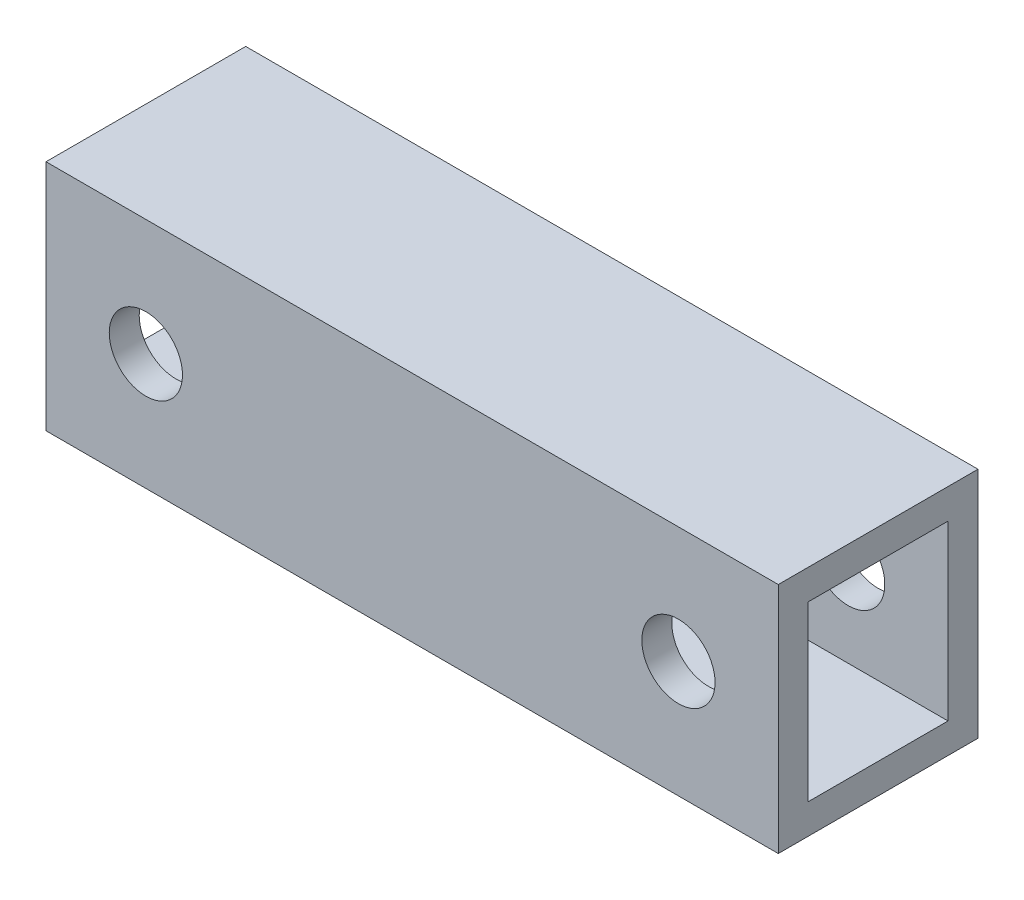
ISO-10303-21;
HEADER;
FILE_DESCRIPTION(('STEP AP214'),'2;1');
FILE_NAME('part.step','',(''),(''),'','','');
FILE_SCHEMA(('AUTOMOTIVE_DESIGN { 1 0 10303 214 1 1 1 1 }'));
ENDSEC;
DATA;
#1=APPLICATION_CONTEXT('core data for automotive mechanical design processes');
#2=APPLICATION_PROTOCOL_DEFINITION('international standard','automotive_design',2000,#1);
#3=PRODUCT_CONTEXT('',#1,'mechanical');
#4=PRODUCT('Part','Part','',(#3));
#5=PRODUCT_RELATED_PRODUCT_CATEGORY('part','',(#4));
#6=PRODUCT_DEFINITION_FORMATION('','',#4);
#7=PRODUCT_DEFINITION_CONTEXT('part definition',#1,'design');
#8=PRODUCT_DEFINITION('design','',#6,#7);
#9=PRODUCT_DEFINITION_SHAPE('','',#8);
#10=(LENGTH_UNIT() NAMED_UNIT(*) SI_UNIT(.MILLI.,.METRE.));
#11=(NAMED_UNIT(*) PLANE_ANGLE_UNIT() SI_UNIT($,.RADIAN.));
#12=(NAMED_UNIT(*) SI_UNIT($,.STERADIAN.) SOLID_ANGLE_UNIT());
#13=UNCERTAINTY_MEASURE_WITH_UNIT(LENGTH_MEASURE(1.E-05),#10,'distance_accuracy_value','');
#14=(GEOMETRIC_REPRESENTATION_CONTEXT(3) GLOBAL_UNCERTAINTY_ASSIGNED_CONTEXT((#13)) GLOBAL_UNIT_ASSIGNED_CONTEXT((#10,
#11,#12)) REPRESENTATION_CONTEXT('',''));
#15=CARTESIAN_POINT('',(0.,0.,0.));
#16=DIRECTION('',(0.,0.,1.));
#17=DIRECTION('',(1.,0.,0.));
#18=AXIS2_PLACEMENT_3D('',#15,#16,#17);
#19=CARTESIAN_POINT('',(54.,-17.,5.));
#20=DIRECTION('',(1.,0.,0.));
#21=DIRECTION('',(0.,0.,-1.));
#22=AXIS2_PLACEMENT_3D('',#19,#20,#21);
#23=PLANE('',#22);
#24=DIRECTION('',(0.,-1.,0.));
#25=VECTOR('',#24,1.);
#26=CARTESIAN_POINT('',(54.,-17.,-1.));
#27=LINE('',#26,#25);
#28=CARTESIAN_POINT('',(54.,-10.,-1.));
#29=VERTEX_POINT('',#28);
#30=CARTESIAN_POINT('',(54.,-17.,-1.));
#31=VERTEX_POINT('',#30);
#32=EDGE_CURVE('E183',#29,#31,#27,.T.);
#33=ORIENTED_EDGE('',*,*,#32,.T.);
#34=DIRECTION('',(0.,0.,-1.));
#35=VECTOR('',#34,1.);
#36=CARTESIAN_POINT('',(54.,-17.,5.));
#37=LINE('',#36,#35);
#38=CARTESIAN_POINT('',(54.,-17.,5.));
#39=VERTEX_POINT('',#38);
#40=EDGE_CURVE('E113',#39,#31,#37,.T.);
#41=ORIENTED_EDGE('',*,*,#40,.F.);
#42=DIRECTION('',(0.,-1.,0.));
#43=VECTOR('',#42,1.);
#44=CARTESIAN_POINT('',(54.,-17.,5.));
#45=LINE('',#44,#43);
#46=CARTESIAN_POINT('',(54.,-10.,5.));
#47=VERTEX_POINT('',#46);
#48=EDGE_CURVE('E186',#47,#39,#45,.T.);
#49=ORIENTED_EDGE('',*,*,#48,.F.);
#50=DIRECTION('',(0.,0.,-1.));
#51=VECTOR('',#50,1.);
#52=CARTESIAN_POINT('',(54.,-10.,5.));
#53=LINE('',#52,#51);
#54=EDGE_CURVE('E199',#47,#29,#53,.T.);
#55=ORIENTED_EDGE('',*,*,#54,.T.);
#56=EDGE_LOOP('',(#33,#41,#49,#55));
#57=FACE_BOUND('',#56,.T.);
#58=DIRECTION('',(0.,1.,0.));
#59=VECTOR('',#58,1.);
#60=CARTESIAN_POINT('',(54.,-17.,4.1));
#61=LINE('',#60,#59);
#62=CARTESIAN_POINT('',(54.,-16.1,4.1));
#63=VERTEX_POINT('',#62);
#64=CARTESIAN_POINT('',(54.,-10.9,4.1));
#65=VERTEX_POINT('',#64);
#66=EDGE_CURVE('E180',#63,#65,#61,.T.);
#67=ORIENTED_EDGE('',*,*,#66,.F.);
#68=DIRECTION('',(0.,0.,1.));
#69=VECTOR('',#68,1.);
#70=CARTESIAN_POINT('',(54.,-16.1,5.));
#71=LINE('',#70,#69);
#72=CARTESIAN_POINT('',(54.,-16.1,-0.1));
#73=VERTEX_POINT('',#72);
#74=EDGE_CURVE('E185',#73,#63,#71,.T.);
#75=ORIENTED_EDGE('',*,*,#74,.F.);
#76=DIRECTION('',(0.,1.,0.));
#77=VECTOR('',#76,1.);
#78=CARTESIAN_POINT('',(54.,-17.,-0.1));
#79=LINE('',#78,#77);
#80=CARTESIAN_POINT('',(54.,-10.9,-0.1));
#81=VERTEX_POINT('',#80);
#82=EDGE_CURVE('E175',#73,#81,#79,.T.);
#83=ORIENTED_EDGE('',*,*,#82,.T.);
#84=DIRECTION('',(0.,0.,-1.));
#85=VECTOR('',#84,1.);
#86=CARTESIAN_POINT('',(54.,-10.9,5.));
#87=LINE('',#86,#85);
#88=EDGE_CURVE('E125',#65,#81,#87,.T.);
#89=ORIENTED_EDGE('',*,*,#88,.F.);
#90=EDGE_LOOP('',(#67,#75,#83,#89));
#91=FACE_BOUND('',#90,.T.);
#92=ADVANCED_FACE('F44',(#57,#91),#23,.F.);
#93=CARTESIAN_POINT('',(76.,-17.,5.));
#94=DIRECTION('',(-1.,0.,0.));
#95=DIRECTION('',(0.,0.,1.));
#96=AXIS2_PLACEMENT_3D('',#93,#94,#95);
#97=PLANE('',#96);
#98=DIRECTION('',(0.,1.,0.));
#99=VECTOR('',#98,1.);
#100=CARTESIAN_POINT('',(76.,-17.,-1.));
#101=LINE('',#100,#99);
#102=CARTESIAN_POINT('',(76.,-17.,-1.));
#103=VERTEX_POINT('',#102);
#104=CARTESIAN_POINT('',(76.,-10.,-1.));
#105=VERTEX_POINT('',#104);
#106=EDGE_CURVE('E210',#103,#105,#101,.T.);
#107=ORIENTED_EDGE('',*,*,#106,.T.);
#108=DIRECTION('',(0.,0.,-1.));
#109=VECTOR('',#108,1.);
#110=CARTESIAN_POINT('',(76.,-10.,5.));
#111=LINE('',#110,#109);
#112=CARTESIAN_POINT('',(76.,-10.,5.));
#113=VERTEX_POINT('',#112);
#114=EDGE_CURVE('E214',#113,#105,#111,.T.);
#115=ORIENTED_EDGE('',*,*,#114,.F.);
#116=DIRECTION('',(0.,1.,0.));
#117=VECTOR('',#116,1.);
#118=CARTESIAN_POINT('',(76.,-17.,5.));
#119=LINE('',#118,#117);
#120=CARTESIAN_POINT('',(76.,-17.,5.));
#121=VERTEX_POINT('',#120);
#122=EDGE_CURVE('E193',#121,#113,#119,.T.);
#123=ORIENTED_EDGE('',*,*,#122,.F.);
#124=DIRECTION('',(0.,0.,-1.));
#125=VECTOR('',#124,1.);
#126=CARTESIAN_POINT('',(76.,-17.,5.));
#127=LINE('',#126,#125);
#128=EDGE_CURVE('E218',#121,#103,#127,.T.);
#129=ORIENTED_EDGE('',*,*,#128,.T.);
#130=EDGE_LOOP('',(#107,#115,#123,#129));
#131=FACE_BOUND('',#130,.T.);
#132=DIRECTION('',(0.,-1.,0.));
#133=VECTOR('',#132,1.);
#134=CARTESIAN_POINT('',(76.,-17.,4.1));
#135=LINE('',#134,#133);
#136=CARTESIAN_POINT('',(76.,-10.9,4.1));
#137=VERTEX_POINT('',#136);
#138=CARTESIAN_POINT('',(76.,-16.1,4.1));
#139=VERTEX_POINT('',#138);
#140=EDGE_CURVE('E11',#137,#139,#135,.T.);
#141=ORIENTED_EDGE('',*,*,#140,.F.);
#142=DIRECTION('',(0.,0.,1.));
#143=VECTOR('',#142,1.);
#144=CARTESIAN_POINT('',(76.,-10.9,5.));
#145=LINE('',#144,#143);
#146=CARTESIAN_POINT('',(76.,-10.9,-0.1));
#147=VERTEX_POINT('',#146);
#148=EDGE_CURVE('E111',#147,#137,#145,.T.);
#149=ORIENTED_EDGE('',*,*,#148,.F.);
#150=DIRECTION('',(0.,-1.,0.));
#151=VECTOR('',#150,1.);
#152=CARTESIAN_POINT('',(76.,-17.,-0.1));
#153=LINE('',#152,#151);
#154=CARTESIAN_POINT('',(76.,-16.1,-0.1));
#155=VERTEX_POINT('',#154);
#156=EDGE_CURVE('E107',#147,#155,#153,.T.);
#157=ORIENTED_EDGE('',*,*,#156,.T.);
#158=DIRECTION('',(0.,0.,-1.));
#159=VECTOR('',#158,1.);
#160=CARTESIAN_POINT('',(76.,-16.1,5.));
#161=LINE('',#160,#159);
#162=EDGE_CURVE('E53',#139,#155,#161,.T.);
#163=ORIENTED_EDGE('',*,*,#162,.F.);
#164=EDGE_LOOP('',(#141,#149,#157,#163));
#165=FACE_BOUND('',#164,.T.);
#166=ADVANCED_FACE('F126',(#131,#165),#97,.F.);
#167=CARTESIAN_POINT('',(54.,-17.,5.));
#168=DIRECTION('',(0.,1.,0.));
#169=DIRECTION('',(0.,0.,1.));
#170=AXIS2_PLACEMENT_3D('',#167,#168,#169);
#171=PLANE('',#170);
#172=DIRECTION('',(1.,0.,0.));
#173=VECTOR('',#172,1.);
#174=CARTESIAN_POINT('',(54.,-17.,-1.));
#175=LINE('',#174,#173);
#176=EDGE_CURVE('E204',#31,#103,#175,.T.);
#177=ORIENTED_EDGE('',*,*,#176,.T.);
#178=ORIENTED_EDGE('',*,*,#128,.F.);
#179=DIRECTION('',(1.,0.,0.));
#180=VECTOR('',#179,1.);
#181=CARTESIAN_POINT('',(54.,-17.,5.));
#182=LINE('',#181,#180);
#183=EDGE_CURVE('E189',#39,#121,#182,.T.);
#184=ORIENTED_EDGE('',*,*,#183,.F.);
#185=ORIENTED_EDGE('',*,*,#40,.T.);
#186=EDGE_LOOP('',(#177,#178,#184,#185));
#187=FACE_BOUND('',#186,.T.);
#188=ADVANCED_FACE('F226',(#187),#171,.F.);
#189=CARTESIAN_POINT('',(54.,-10.,5.));
#190=DIRECTION('',(0.,-1.,0.));
#191=DIRECTION('',(0.,0.,-1.));
#192=AXIS2_PLACEMENT_3D('',#189,#190,#191);
#193=PLANE('',#192);
#194=DIRECTION('',(-1.,0.,0.));
#195=VECTOR('',#194,1.);
#196=CARTESIAN_POINT('',(54.,-10.,-1.));
#197=LINE('',#196,#195);
#198=EDGE_CURVE('E191',#105,#29,#197,.T.);
#199=ORIENTED_EDGE('',*,*,#198,.T.);
#200=ORIENTED_EDGE('',*,*,#54,.F.);
#201=DIRECTION('',(-1.,0.,0.));
#202=VECTOR('',#201,1.);
#203=CARTESIAN_POINT('',(54.,-10.,5.));
#204=LINE('',#203,#202);
#205=EDGE_CURVE('E197',#113,#47,#204,.T.);
#206=ORIENTED_EDGE('',*,*,#205,.F.);
#207=ORIENTED_EDGE('',*,*,#114,.T.);
#208=EDGE_LOOP('',(#199,#200,#206,#207));
#209=FACE_BOUND('',#208,.T.);
#210=ADVANCED_FACE('F245',(#209),#193,.F.);
#211=CARTESIAN_POINT('',(0.,0.,5.));
#212=DIRECTION('',(0.,0.,-1.));
#213=DIRECTION('',(-1.,0.,0.));
#214=AXIS2_PLACEMENT_3D('',#211,#212,#213);
#215=PLANE('',#214);
#216=CARTESIAN_POINT('',(57.,-13.5,5.));
#217=DIRECTION('',(0.,0.,1.));
#218=DIRECTION('',(1.,0.,0.));
#219=AXIS2_PLACEMENT_3D('',#216,#217,#218);
#220=CIRCLE('',#219,1.1);
#221=CARTESIAN_POINT('',(58.1,-13.5,5.));
#222=VERTEX_POINT('',#221);
#223=EDGE_CURVE('E137',#222,#222,#220,.T.);
#224=ORIENTED_EDGE('',*,*,#223,.F.);
#225=EDGE_LOOP('',(#224));
#226=FACE_BOUND('',#225,.T.);
#227=CARTESIAN_POINT('',(73.,-13.5,5.));
#228=DIRECTION('',(0.,0.,1.));
#229=DIRECTION('',(1.,0.,0.));
#230=AXIS2_PLACEMENT_3D('',#227,#228,#229);
#231=CIRCLE('',#230,1.1);
#232=CARTESIAN_POINT('',(74.1,-13.5,5.));
#233=VERTEX_POINT('',#232);
#234=EDGE_CURVE('E150',#233,#233,#231,.T.);
#235=ORIENTED_EDGE('',*,*,#234,.F.);
#236=EDGE_LOOP('',(#235));
#237=FACE_BOUND('',#236,.T.);
#238=ORIENTED_EDGE('',*,*,#48,.T.);
#239=ORIENTED_EDGE('',*,*,#183,.T.);
#240=ORIENTED_EDGE('',*,*,#122,.T.);
#241=ORIENTED_EDGE('',*,*,#205,.T.);
#242=EDGE_LOOP('',(#238,#239,#240,#241));
#243=FACE_BOUND('',#242,.T.);
#244=ADVANCED_FACE('F243',(#226,#237,#243),#215,.F.);
#245=CARTESIAN_POINT('',(0.,0.,-1.));
#246=DIRECTION('',(0.,0.,-1.));
#247=DIRECTION('',(-1.,0.,0.));
#248=AXIS2_PLACEMENT_3D('',#245,#246,#247);
#249=PLANE('',#248);
#250=CARTESIAN_POINT('',(57.,-13.5,-1.));
#251=DIRECTION('',(0.,0.,-1.));
#252=DIRECTION('',(-1.,0.,0.));
#253=AXIS2_PLACEMENT_3D('',#250,#251,#252);
#254=CIRCLE('',#253,1.1);
#255=CARTESIAN_POINT('',(55.9,-13.5,-1.));
#256=VERTEX_POINT('',#255);
#257=EDGE_CURVE('E165',#256,#256,#254,.F.);
#258=ORIENTED_EDGE('',*,*,#257,.T.);
#259=EDGE_LOOP('',(#258));
#260=FACE_BOUND('',#259,.T.);
#261=CARTESIAN_POINT('',(73.,-13.5,-1.));
#262=DIRECTION('',(0.,0.,-1.));
#263=DIRECTION('',(-1.,0.,0.));
#264=AXIS2_PLACEMENT_3D('',#261,#262,#263);
#265=CIRCLE('',#264,1.1);
#266=CARTESIAN_POINT('',(71.9,-13.5,-1.));
#267=VERTEX_POINT('',#266);
#268=EDGE_CURVE('E145',#267,#267,#265,.F.);
#269=ORIENTED_EDGE('',*,*,#268,.T.);
#270=EDGE_LOOP('',(#269));
#271=FACE_BOUND('',#270,.T.);
#272=ORIENTED_EDGE('',*,*,#32,.F.);
#273=ORIENTED_EDGE('',*,*,#198,.F.);
#274=ORIENTED_EDGE('',*,*,#106,.F.);
#275=ORIENTED_EDGE('',*,*,#176,.F.);
#276=EDGE_LOOP('',(#272,#273,#274,#275));
#277=FACE_BOUND('',#276,.T.);
#278=ADVANCED_FACE('F234',(#260,#271,#277),#249,.T.);
#279=CARTESIAN_POINT('',(53.,-16.1,4.1));
#280=DIRECTION('',(0.,1.,0.));
#281=DIRECTION('',(0.,0.,1.));
#282=AXIS2_PLACEMENT_3D('',#279,#280,#281);
#283=PLANE('',#282);
#284=ORIENTED_EDGE('',*,*,#74,.T.);
#285=DIRECTION('',(1.,0.,0.));
#286=VECTOR('',#285,1.);
#287=CARTESIAN_POINT('',(53.,-16.1,4.1));
#288=LINE('',#287,#286);
#289=EDGE_CURVE('E124',#63,#139,#288,.T.);
#290=ORIENTED_EDGE('',*,*,#289,.T.);
#291=ORIENTED_EDGE('',*,*,#162,.T.);
#292=DIRECTION('',(1.,0.,0.));
#293=VECTOR('',#292,1.);
#294=CARTESIAN_POINT('',(53.,-16.1,-0.1));
#295=LINE('',#294,#293);
#296=EDGE_CURVE('E70',#73,#155,#295,.T.);
#297=ORIENTED_EDGE('',*,*,#296,.F.);
#298=EDGE_LOOP('',(#284,#290,#291,#297));
#299=FACE_BOUND('',#298,.T.);
#300=ADVANCED_FACE('F252',(#299),#283,.T.);
#301=CARTESIAN_POINT('',(53.,-10.9,4.1));
#302=DIRECTION('',(0.,-1.,0.));
#303=DIRECTION('',(0.,0.,-1.));
#304=AXIS2_PLACEMENT_3D('',#301,#302,#303);
#305=PLANE('',#304);
#306=ORIENTED_EDGE('',*,*,#88,.T.);
#307=DIRECTION('',(-1.,0.,0.));
#308=VECTOR('',#307,1.);
#309=CARTESIAN_POINT('',(53.,-10.9,-0.1));
#310=LINE('',#309,#308);
#311=EDGE_CURVE('E65',#147,#81,#310,.T.);
#312=ORIENTED_EDGE('',*,*,#311,.F.);
#313=ORIENTED_EDGE('',*,*,#148,.T.);
#314=DIRECTION('',(-1.,0.,0.));
#315=VECTOR('',#314,1.);
#316=CARTESIAN_POINT('',(53.,-10.9,4.1));
#317=LINE('',#316,#315);
#318=EDGE_CURVE('E166',#137,#65,#317,.T.);
#319=ORIENTED_EDGE('',*,*,#318,.T.);
#320=EDGE_LOOP('',(#306,#312,#313,#319));
#321=FACE_BOUND('',#320,.T.);
#322=ADVANCED_FACE('F117',(#321),#305,.T.);
#323=CARTESIAN_POINT('',(0.,0.,4.1));
#324=DIRECTION('',(0.,0.,-1.));
#325=DIRECTION('',(-1.,0.,0.));
#326=AXIS2_PLACEMENT_3D('',#323,#324,#325);
#327=PLANE('',#326);
#328=CARTESIAN_POINT('',(57.,-13.5,4.1));
#329=DIRECTION('',(0.,0.,-1.));
#330=DIRECTION('',(-1.,0.,0.));
#331=AXIS2_PLACEMENT_3D('',#328,#329,#330);
#332=CIRCLE('',#331,1.1);
#333=CARTESIAN_POINT('',(55.9,-13.5,4.1));
#334=VERTEX_POINT('',#333);
#335=EDGE_CURVE('E158',#334,#334,#332,.F.);
#336=ORIENTED_EDGE('',*,*,#335,.T.);
#337=EDGE_LOOP('',(#336));
#338=FACE_BOUND('',#337,.T.);
#339=CARTESIAN_POINT('',(73.,-13.5,4.1));
#340=DIRECTION('',(0.,0.,-1.));
#341=DIRECTION('',(-1.,0.,0.));
#342=AXIS2_PLACEMENT_3D('',#339,#340,#341);
#343=CIRCLE('',#342,1.1);
#344=CARTESIAN_POINT('',(71.9,-13.5,4.1));
#345=VERTEX_POINT('',#344);
#346=EDGE_CURVE('E140',#345,#345,#343,.F.);
#347=ORIENTED_EDGE('',*,*,#346,.T.);
#348=EDGE_LOOP('',(#347));
#349=FACE_BOUND('',#348,.T.);
#350=ORIENTED_EDGE('',*,*,#66,.T.);
#351=ORIENTED_EDGE('',*,*,#318,.F.);
#352=ORIENTED_EDGE('',*,*,#140,.T.);
#353=ORIENTED_EDGE('',*,*,#289,.F.);
#354=EDGE_LOOP('',(#350,#351,#352,#353));
#355=FACE_BOUND('',#354,.T.);
#356=ADVANCED_FACE('F309',(#338,#349,#355),#327,.T.);
#357=CARTESIAN_POINT('',(0.,0.,-0.1));
#358=DIRECTION('',(0.,0.,-1.));
#359=DIRECTION('',(-1.,0.,0.));
#360=AXIS2_PLACEMENT_3D('',#357,#358,#359);
#361=PLANE('',#360);
#362=CARTESIAN_POINT('',(57.,-13.5,-0.1));
#363=DIRECTION('',(0.,0.,-1.));
#364=DIRECTION('',(-1.,0.,0.));
#365=AXIS2_PLACEMENT_3D('',#362,#363,#364);
#366=CIRCLE('',#365,1.1);
#367=CARTESIAN_POINT('',(55.9,-13.5,-0.1));
#368=VERTEX_POINT('',#367);
#369=EDGE_CURVE('E48',#368,#368,#366,.F.);
#370=ORIENTED_EDGE('',*,*,#369,.F.);
#371=EDGE_LOOP('',(#370));
#372=FACE_BOUND('',#371,.T.);
#373=CARTESIAN_POINT('',(73.,-13.5,-0.1));
#374=DIRECTION('',(0.,0.,-1.));
#375=DIRECTION('',(-1.,0.,0.));
#376=AXIS2_PLACEMENT_3D('',#373,#374,#375);
#377=CIRCLE('',#376,1.1);
#378=CARTESIAN_POINT('',(71.9,-13.5,-0.1));
#379=VERTEX_POINT('',#378);
#380=EDGE_CURVE('E133',#379,#379,#377,.F.);
#381=ORIENTED_EDGE('',*,*,#380,.F.);
#382=EDGE_LOOP('',(#381));
#383=FACE_BOUND('',#382,.T.);
#384=ORIENTED_EDGE('',*,*,#296,.T.);
#385=ORIENTED_EDGE('',*,*,#156,.F.);
#386=ORIENTED_EDGE('',*,*,#311,.T.);
#387=ORIENTED_EDGE('',*,*,#82,.F.);
#388=EDGE_LOOP('',(#384,#385,#386,#387));
#389=FACE_BOUND('',#388,.T.);
#390=ADVANCED_FACE('F108',(#372,#383,#389),#361,.F.);
#391=CARTESIAN_POINT('',(73.,-13.5,5.));
#392=DIRECTION('',(0.,0.,-1.));
#393=DIRECTION('',(-1.,0.,0.));
#394=AXIS2_PLACEMENT_3D('',#391,#392,#393);
#395=CYLINDRICAL_SURFACE('',#394,1.1);
#396=ORIENTED_EDGE('',*,*,#268,.F.);
#397=EDGE_LOOP('',(#396));
#398=FACE_BOUND('',#397,.T.);
#399=ORIENTED_EDGE('',*,*,#380,.T.);
#400=EDGE_LOOP('',(#399));
#401=FACE_BOUND('',#400,.T.);
#402=ADVANCED_FACE('F330',(#398,#401),#395,.F.);
#403=CARTESIAN_POINT('',(57.,-13.5,5.));
#404=DIRECTION('',(0.,0.,-1.));
#405=DIRECTION('',(-1.,0.,0.));
#406=AXIS2_PLACEMENT_3D('',#403,#404,#405);
#407=CYLINDRICAL_SURFACE('',#406,1.1);
#408=ORIENTED_EDGE('',*,*,#257,.F.);
#409=EDGE_LOOP('',(#408));
#410=FACE_BOUND('',#409,.T.);
#411=ORIENTED_EDGE('',*,*,#369,.T.);
#412=EDGE_LOOP('',(#411));
#413=FACE_BOUND('',#412,.T.);
#414=ADVANCED_FACE('F340',(#410,#413),#407,.F.);
#415=ORIENTED_EDGE('',*,*,#346,.F.);
#416=EDGE_LOOP('',(#415));
#417=FACE_BOUND('',#416,.T.);
#418=ORIENTED_EDGE('',*,*,#234,.T.);
#419=EDGE_LOOP('',(#418));
#420=FACE_BOUND('',#419,.T.);
#421=ADVANCED_FACE('F339',(#417,#420),#395,.F.);
#422=ORIENTED_EDGE('',*,*,#335,.F.);
#423=EDGE_LOOP('',(#422));
#424=FACE_BOUND('',#423,.T.);
#425=ORIENTED_EDGE('',*,*,#223,.T.);
#426=EDGE_LOOP('',(#425));
#427=FACE_BOUND('',#426,.T.);
#428=ADVANCED_FACE('F348',(#424,#427),#407,.F.);
#429=CLOSED_SHELL('',(#92,#166,#188,#210,#244,#278,#300,#322,#356,#390,#402,#414,#421,#428));
#430=MANIFOLD_SOLID_BREP('B2',#429);
#431=ADVANCED_BREP_SHAPE_REPRESENTATION('',(#18,#430),#14);
#432=SHAPE_DEFINITION_REPRESENTATION(#9,#431);
ENDSEC;
END-ISO-10303-21;
